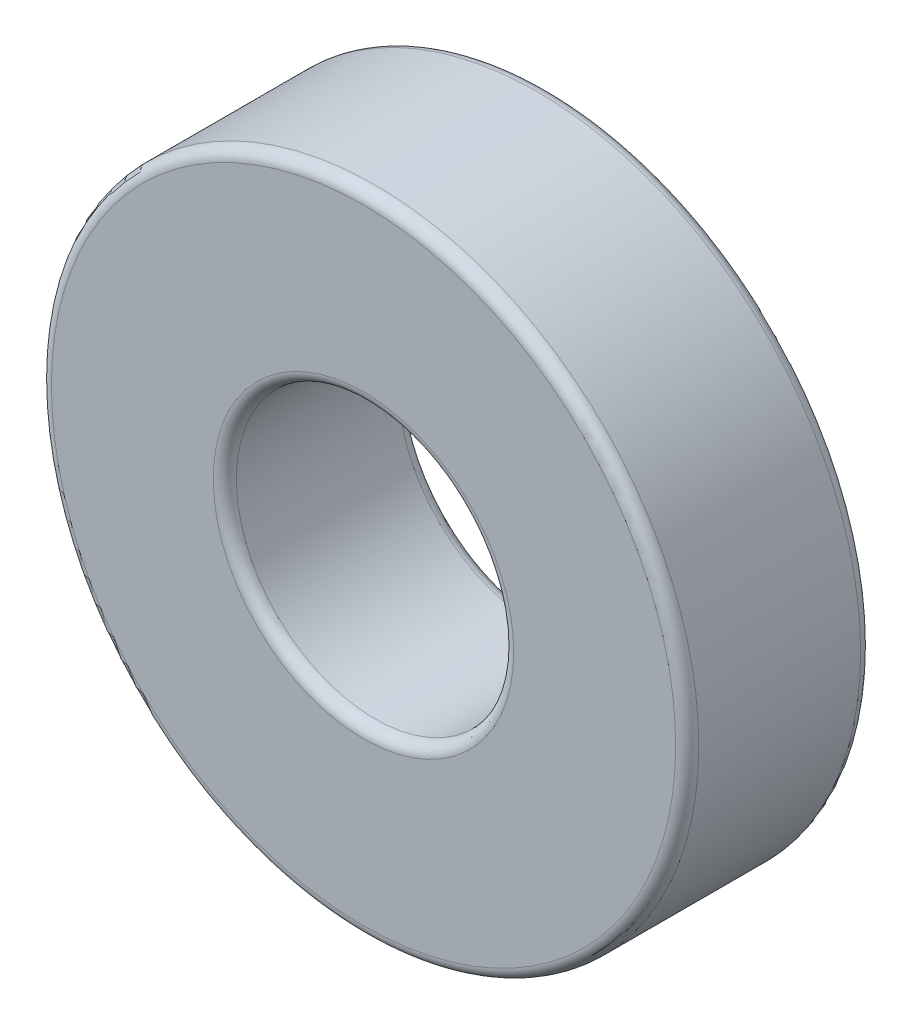
ISO-10303-21;
HEADER;
FILE_DESCRIPTION(('STEP AP214'),'2;1');
FILE_NAME('part.step','',(''),(''),'','','');
FILE_SCHEMA(('AUTOMOTIVE_DESIGN { 1 0 10303 214 1 1 1 1 }'));
ENDSEC;
DATA;
#1=APPLICATION_CONTEXT('core data for automotive mechanical design processes');
#2=APPLICATION_PROTOCOL_DEFINITION('international standard','automotive_design',2000,#1);
#3=PRODUCT_CONTEXT('',#1,'mechanical');
#4=PRODUCT('Part','Part','',(#3));
#5=PRODUCT_RELATED_PRODUCT_CATEGORY('part','',(#4));
#6=PRODUCT_DEFINITION_FORMATION('','',#4);
#7=PRODUCT_DEFINITION_CONTEXT('part definition',#1,'design');
#8=PRODUCT_DEFINITION('design','',#6,#7);
#9=PRODUCT_DEFINITION_SHAPE('','',#8);
#10=(LENGTH_UNIT() NAMED_UNIT(*) SI_UNIT(.MILLI.,.METRE.));
#11=(NAMED_UNIT(*) PLANE_ANGLE_UNIT() SI_UNIT($,.RADIAN.));
#12=(NAMED_UNIT(*) SI_UNIT($,.STERADIAN.) SOLID_ANGLE_UNIT());
#13=UNCERTAINTY_MEASURE_WITH_UNIT(LENGTH_MEASURE(1.E-05),#10,'distance_accuracy_value','');
#14=(GEOMETRIC_REPRESENTATION_CONTEXT(3) GLOBAL_UNCERTAINTY_ASSIGNED_CONTEXT((#13)) GLOBAL_UNIT_ASSIGNED_CONTEXT((#10,
#11,#12)) REPRESENTATION_CONTEXT('',''));
#15=CARTESIAN_POINT('',(0.,0.,0.));
#16=DIRECTION('',(0.,0.,1.));
#17=DIRECTION('',(1.,0.,0.));
#18=AXIS2_PLACEMENT_3D('',#15,#16,#17);
#19=CARTESIAN_POINT('',(0.,0.,8.));
#20=DIRECTION('',(0.,0.,1.));
#21=DIRECTION('',(1.,0.,0.));
#22=AXIS2_PLACEMENT_3D('',#19,#20,#21);
#23=PLANE('',#22);
#24=CARTESIAN_POINT('',(0.,0.,8.));
#25=DIRECTION('',(0.,0.,1.));
#26=DIRECTION('',(1.,0.,0.));
#27=AXIS2_PLACEMENT_3D('',#24,#25,#26);
#28=CIRCLE('',#27,6.5);
#29=CARTESIAN_POINT('',(6.5,0.,8.));
#30=VERTEX_POINT('',#29);
#31=EDGE_CURVE('E10',#30,#30,#28,.F.);
#32=ORIENTED_EDGE('',*,*,#31,.T.);
#33=EDGE_LOOP('',(#32));
#34=FACE_BOUND('',#33,.T.);
#35=CARTESIAN_POINT('',(0.,0.,8.));
#36=DIRECTION('',(0.,0.,1.));
#37=DIRECTION('',(1.,0.,0.));
#38=AXIS2_PLACEMENT_3D('',#35,#36,#37);
#39=CIRCLE('',#38,13.5);
#40=CARTESIAN_POINT('',(13.5,0.,8.));
#41=VERTEX_POINT('',#40);
#42=EDGE_CURVE('E40',#41,#41,#39,.T.);
#43=ORIENTED_EDGE('',*,*,#42,.T.);
#44=EDGE_LOOP('',(#43));
#45=FACE_BOUND('',#44,.T.);
#46=ADVANCED_FACE('F33',(#34,#45),#23,.T.);
#47=CARTESIAN_POINT('',(0.,0.,0.));
#48=DIRECTION('',(0.,0.,1.));
#49=DIRECTION('',(1.,0.,0.));
#50=AXIS2_PLACEMENT_3D('',#47,#48,#49);
#51=PLANE('',#50);
#52=CARTESIAN_POINT('',(0.,0.,0.));
#53=DIRECTION('',(0.,0.,1.));
#54=DIRECTION('',(1.,0.,0.));
#55=AXIS2_PLACEMENT_3D('',#52,#53,#54);
#56=CIRCLE('',#55,6.5);
#57=CARTESIAN_POINT('',(6.5,0.,0.));
#58=VERTEX_POINT('',#57);
#59=EDGE_CURVE('E59',#58,#58,#56,.T.);
#60=ORIENTED_EDGE('',*,*,#59,.T.);
#61=EDGE_LOOP('',(#60));
#62=FACE_BOUND('',#61,.T.);
#63=CARTESIAN_POINT('',(0.,0.,0.));
#64=DIRECTION('',(0.,0.,1.));
#65=DIRECTION('',(1.,0.,0.));
#66=AXIS2_PLACEMENT_3D('',#63,#64,#65);
#67=CIRCLE('',#66,13.5);
#68=CARTESIAN_POINT('',(13.5,0.,0.));
#69=VERTEX_POINT('',#68);
#70=EDGE_CURVE('E62',#69,#69,#67,.F.);
#71=ORIENTED_EDGE('',*,*,#70,.T.);
#72=EDGE_LOOP('',(#71));
#73=FACE_BOUND('',#72,.T.);
#74=ADVANCED_FACE('F66',(#62,#73),#51,.F.);
#75=CARTESIAN_POINT('',(0.,0.,8.));
#76=DIRECTION('',(0.,0.,-1.));
#77=DIRECTION('',(-1.,0.,0.));
#78=AXIS2_PLACEMENT_3D('',#75,#76,#77);
#79=CYLINDRICAL_SURFACE('',#78,14.);
#80=CARTESIAN_POINT('',(0.,0.,0.5));
#81=DIRECTION('',(0.,0.,1.));
#82=DIRECTION('',(1.,0.,0.));
#83=AXIS2_PLACEMENT_3D('',#80,#81,#82);
#84=CIRCLE('',#83,14.);
#85=CARTESIAN_POINT('',(14.,0.,0.5));
#86=VERTEX_POINT('',#85);
#87=EDGE_CURVE('E44',#86,#86,#84,.T.);
#88=ORIENTED_EDGE('',*,*,#87,.T.);
#89=EDGE_LOOP('',(#88));
#90=FACE_BOUND('',#89,.T.);
#91=CARTESIAN_POINT('',(0.,0.,7.5));
#92=DIRECTION('',(0.,0.,1.));
#93=DIRECTION('',(1.,0.,0.));
#94=AXIS2_PLACEMENT_3D('',#91,#92,#93);
#95=CIRCLE('',#94,14.);
#96=CARTESIAN_POINT('',(14.,0.,7.5));
#97=VERTEX_POINT('',#96);
#98=EDGE_CURVE('E48',#97,#97,#95,.F.);
#99=ORIENTED_EDGE('',*,*,#98,.T.);
#100=EDGE_LOOP('',(#99));
#101=FACE_BOUND('',#100,.T.);
#102=ADVANCED_FACE('F76',(#90,#101),#79,.T.);
#103=CARTESIAN_POINT('',(0.,0.,8.));
#104=DIRECTION('',(0.,0.,-1.));
#105=DIRECTION('',(-1.,0.,0.));
#106=AXIS2_PLACEMENT_3D('',#103,#104,#105);
#107=CYLINDRICAL_SURFACE('',#106,6.);
#108=CARTESIAN_POINT('',(0.,0.,0.5));
#109=DIRECTION('',(0.,0.,1.));
#110=DIRECTION('',(1.,0.,0.));
#111=AXIS2_PLACEMENT_3D('',#108,#109,#110);
#112=CIRCLE('',#111,6.);
#113=CARTESIAN_POINT('',(6.,0.,0.5));
#114=VERTEX_POINT('',#113);
#115=EDGE_CURVE('E53',#114,#114,#112,.F.);
#116=ORIENTED_EDGE('',*,*,#115,.T.);
#117=EDGE_LOOP('',(#116));
#118=FACE_BOUND('',#117,.T.);
#119=CARTESIAN_POINT('',(0.,0.,7.5));
#120=DIRECTION('',(0.,0.,1.));
#121=DIRECTION('',(1.,0.,0.));
#122=AXIS2_PLACEMENT_3D('',#119,#120,#121);
#123=CIRCLE('',#122,6.);
#124=CARTESIAN_POINT('',(6.,0.,7.5));
#125=VERTEX_POINT('',#124);
#126=EDGE_CURVE('E56',#125,#125,#123,.T.);
#127=ORIENTED_EDGE('',*,*,#126,.T.);
#128=EDGE_LOOP('',(#127));
#129=FACE_BOUND('',#128,.T.);
#130=ADVANCED_FACE('F79',(#118,#129),#107,.F.);
#131=CARTESIAN_POINT('',(0.,0.,0.5));
#132=DIRECTION('',(0.,0.,1.));
#133=DIRECTION('',(1.,0.,0.));
#134=AXIS2_PLACEMENT_3D('',#131,#132,#133);
#135=TOROIDAL_SURFACE('',#134,6.5,0.5);
#136=ORIENTED_EDGE('',*,*,#115,.F.);
#137=EDGE_LOOP('',(#136));
#138=FACE_BOUND('',#137,.T.);
#139=ORIENTED_EDGE('',*,*,#59,.F.);
#140=EDGE_LOOP('',(#139));
#141=FACE_BOUND('',#140,.T.);
#142=ADVANCED_FACE('F72',(#138,#141),#135,.T.);
#143=CARTESIAN_POINT('',(0.,0.,0.5));
#144=DIRECTION('',(0.,0.,1.));
#145=DIRECTION('',(1.,0.,0.));
#146=AXIS2_PLACEMENT_3D('',#143,#144,#145);
#147=TOROIDAL_SURFACE('',#146,13.5,0.5);
#148=ORIENTED_EDGE('',*,*,#70,.F.);
#149=EDGE_LOOP('',(#148));
#150=FACE_BOUND('',#149,.T.);
#151=ORIENTED_EDGE('',*,*,#87,.F.);
#152=EDGE_LOOP('',(#151));
#153=FACE_BOUND('',#152,.T.);
#154=ADVANCED_FACE('F68',(#150,#153),#147,.T.);
#155=CARTESIAN_POINT('',(0.,0.,7.5));
#156=DIRECTION('',(0.,0.,1.));
#157=DIRECTION('',(1.,0.,0.));
#158=AXIS2_PLACEMENT_3D('',#155,#156,#157);
#159=TOROIDAL_SURFACE('',#158,6.5,0.5);
#160=ORIENTED_EDGE('',*,*,#31,.F.);
#161=EDGE_LOOP('',(#160));
#162=FACE_BOUND('',#161,.T.);
#163=ORIENTED_EDGE('',*,*,#126,.F.);
#164=EDGE_LOOP('',(#163));
#165=FACE_BOUND('',#164,.T.);
#166=ADVANCED_FACE('F71',(#162,#165),#159,.T.);
#167=CARTESIAN_POINT('',(0.,0.,7.5));
#168=DIRECTION('',(0.,0.,1.));
#169=DIRECTION('',(1.,0.,0.));
#170=AXIS2_PLACEMENT_3D('',#167,#168,#169);
#171=TOROIDAL_SURFACE('',#170,13.5,0.5);
#172=ORIENTED_EDGE('',*,*,#98,.F.);
#173=EDGE_LOOP('',(#172));
#174=FACE_BOUND('',#173,.T.);
#175=ORIENTED_EDGE('',*,*,#42,.F.);
#176=EDGE_LOOP('',(#175));
#177=FACE_BOUND('',#176,.T.);
#178=ADVANCED_FACE('F35',(#174,#177),#171,.T.);
#179=CLOSED_SHELL('',(#46,#74,#102,#130,#142,#154,#166,#178));
#180=MANIFOLD_SOLID_BREP('B2',#179);
#181=ADVANCED_BREP_SHAPE_REPRESENTATION('',(#18,#180),#14);
#182=SHAPE_DEFINITION_REPRESENTATION(#9,#181);
ENDSEC;
END-ISO-10303-21;
